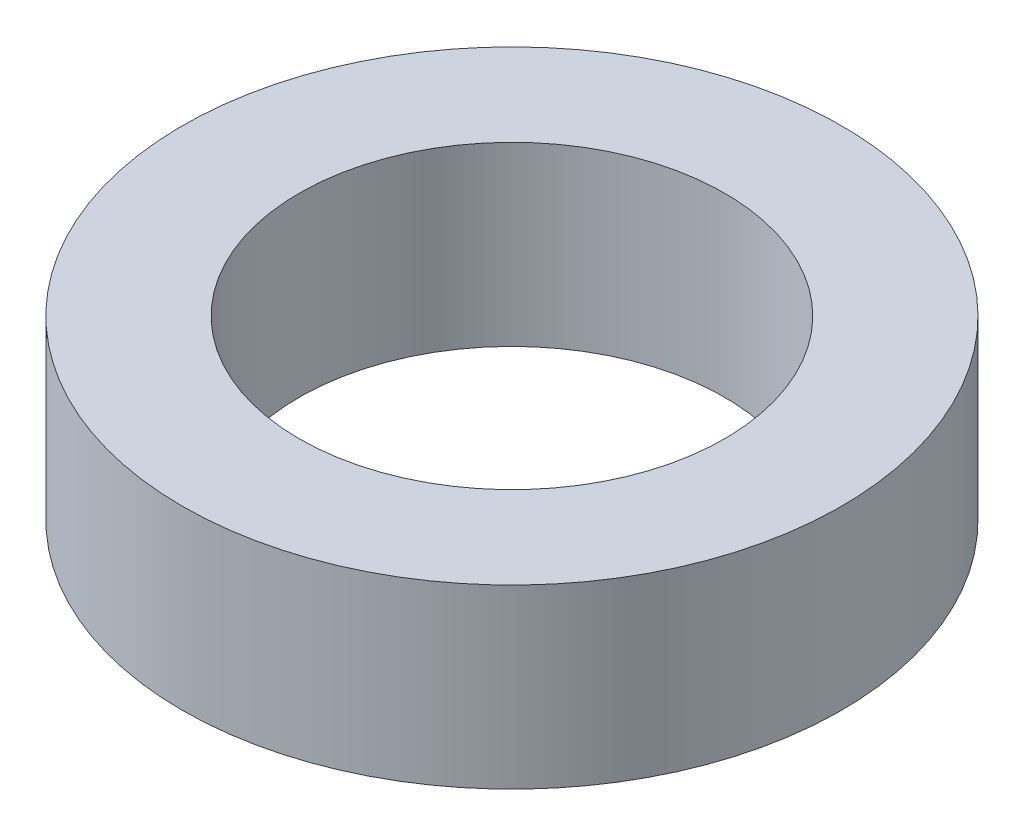
ISO-10303-21;
HEADER;
FILE_DESCRIPTION(('STEP AP214'),'2;1');
FILE_NAME('part.step','',(''),(''),'','','');
FILE_SCHEMA(('AUTOMOTIVE_DESIGN { 1 0 10303 214 1 1 1 1 }'));
ENDSEC;
DATA;
#1=APPLICATION_CONTEXT('core data for automotive mechanical design processes');
#2=APPLICATION_PROTOCOL_DEFINITION('international standard','automotive_design',2000,#1);
#3=PRODUCT_CONTEXT('',#1,'mechanical');
#4=PRODUCT('Part','Part','',(#3));
#5=PRODUCT_RELATED_PRODUCT_CATEGORY('part','',(#4));
#6=PRODUCT_DEFINITION_FORMATION('','',#4);
#7=PRODUCT_DEFINITION_CONTEXT('part definition',#1,'design');
#8=PRODUCT_DEFINITION('design','',#6,#7);
#9=PRODUCT_DEFINITION_SHAPE('','',#8);
#10=(LENGTH_UNIT() NAMED_UNIT(*) SI_UNIT(.MILLI.,.METRE.));
#11=(NAMED_UNIT(*) PLANE_ANGLE_UNIT() SI_UNIT($,.RADIAN.));
#12=(NAMED_UNIT(*) SI_UNIT($,.STERADIAN.) SOLID_ANGLE_UNIT());
#13=UNCERTAINTY_MEASURE_WITH_UNIT(LENGTH_MEASURE(1.E-05),#10,'distance_accuracy_value','');
#14=(GEOMETRIC_REPRESENTATION_CONTEXT(3) GLOBAL_UNCERTAINTY_ASSIGNED_CONTEXT((#13)) GLOBAL_UNIT_ASSIGNED_CONTEXT((#10,
#11,#12)) REPRESENTATION_CONTEXT('',''));
#15=CARTESIAN_POINT('',(0.,0.,0.));
#16=DIRECTION('',(0.,0.,1.));
#17=DIRECTION('',(1.,0.,0.));
#18=AXIS2_PLACEMENT_3D('',#15,#16,#17);
#19=CARTESIAN_POINT('',(0.,2.95,0.));
#20=DIRECTION('',(0.,1.,0.));
#21=DIRECTION('',(0.,0.,1.));
#22=AXIS2_PLACEMENT_3D('',#19,#20,#21);
#23=PLANE('',#22);
#24=CARTESIAN_POINT('',(0.,2.95,0.));
#25=DIRECTION('',(0.,1.,0.));
#26=DIRECTION('',(0.,0.,1.));
#27=AXIS2_PLACEMENT_3D('',#24,#25,#26);
#28=CIRCLE('',#27,5.5);
#29=CARTESIAN_POINT('',(0.,2.95,5.5));
#30=VERTEX_POINT('',#29);
#31=EDGE_CURVE('E10',#30,#30,#28,.T.);
#32=ORIENTED_EDGE('',*,*,#31,.T.);
#33=EDGE_LOOP('',(#32));
#34=FACE_BOUND('',#33,.T.);
#35=CARTESIAN_POINT('',(0.,2.95,0.));
#36=DIRECTION('',(0.,1.,0.));
#37=DIRECTION('',(0.,0.,1.));
#38=AXIS2_PLACEMENT_3D('',#35,#36,#37);
#39=CIRCLE('',#38,3.55);
#40=CARTESIAN_POINT('',(0.,2.95,3.55));
#41=VERTEX_POINT('',#40);
#42=EDGE_CURVE('E50',#41,#41,#39,.T.);
#43=ORIENTED_EDGE('',*,*,#42,.F.);
#44=EDGE_LOOP('',(#43));
#45=FACE_BOUND('',#44,.T.);
#46=ADVANCED_FACE('F39',(#34,#45),#23,.T.);
#47=CARTESIAN_POINT('',(0.,0.,0.));
#48=DIRECTION('',(0.,1.,0.));
#49=DIRECTION('',(0.,0.,1.));
#50=AXIS2_PLACEMENT_3D('',#47,#48,#49);
#51=PLANE('',#50);
#52=CARTESIAN_POINT('',(0.,0.,0.));
#53=DIRECTION('',(0.,1.,0.));
#54=DIRECTION('',(0.,0.,1.));
#55=AXIS2_PLACEMENT_3D('',#52,#53,#54);
#56=CIRCLE('',#55,5.5);
#57=CARTESIAN_POINT('',(0.,0.,5.5));
#58=VERTEX_POINT('',#57);
#59=EDGE_CURVE('E43',#58,#58,#56,.T.);
#60=ORIENTED_EDGE('',*,*,#59,.F.);
#61=EDGE_LOOP('',(#60));
#62=FACE_BOUND('',#61,.T.);
#63=CARTESIAN_POINT('',(0.,0.,0.));
#64=DIRECTION('',(0.,1.,0.));
#65=DIRECTION('',(0.,0.,1.));
#66=AXIS2_PLACEMENT_3D('',#63,#64,#65);
#67=CIRCLE('',#66,3.55);
#68=CARTESIAN_POINT('',(0.,0.,3.55));
#69=VERTEX_POINT('',#68);
#70=EDGE_CURVE('E52',#69,#69,#67,.T.);
#71=ORIENTED_EDGE('',*,*,#70,.T.);
#72=EDGE_LOOP('',(#71));
#73=FACE_BOUND('',#72,.T.);
#74=ADVANCED_FACE('F62',(#62,#73),#51,.F.);
#75=CARTESIAN_POINT('',(0.,2.95,0.));
#76=DIRECTION('',(0.,-1.,0.));
#77=DIRECTION('',(0.,0.,-1.));
#78=AXIS2_PLACEMENT_3D('',#75,#76,#77);
#79=CYLINDRICAL_SURFACE('',#78,5.5);
#80=ORIENTED_EDGE('',*,*,#31,.F.);
#81=EDGE_LOOP('',(#80));
#82=FACE_BOUND('',#81,.T.);
#83=ORIENTED_EDGE('',*,*,#59,.T.);
#84=EDGE_LOOP('',(#83));
#85=FACE_BOUND('',#84,.T.);
#86=ADVANCED_FACE('F41',(#82,#85),#79,.T.);
#87=CARTESIAN_POINT('',(0.,2.95,0.));
#88=DIRECTION('',(0.,-1.,0.));
#89=DIRECTION('',(0.,0.,-1.));
#90=AXIS2_PLACEMENT_3D('',#87,#88,#89);
#91=CYLINDRICAL_SURFACE('',#90,3.55);
#92=ORIENTED_EDGE('',*,*,#42,.T.);
#93=EDGE_LOOP('',(#92));
#94=FACE_BOUND('',#93,.T.);
#95=ORIENTED_EDGE('',*,*,#70,.F.);
#96=EDGE_LOOP('',(#95));
#97=FACE_BOUND('',#96,.T.);
#98=ADVANCED_FACE('F58',(#94,#97),#91,.F.);
#99=CLOSED_SHELL('',(#46,#74,#86,#98));
#100=MANIFOLD_SOLID_BREP('B2',#99);
#101=ADVANCED_BREP_SHAPE_REPRESENTATION('',(#18,#100),#14);
#102=SHAPE_DEFINITION_REPRESENTATION(#9,#101);
ENDSEC;
END-ISO-10303-21;
